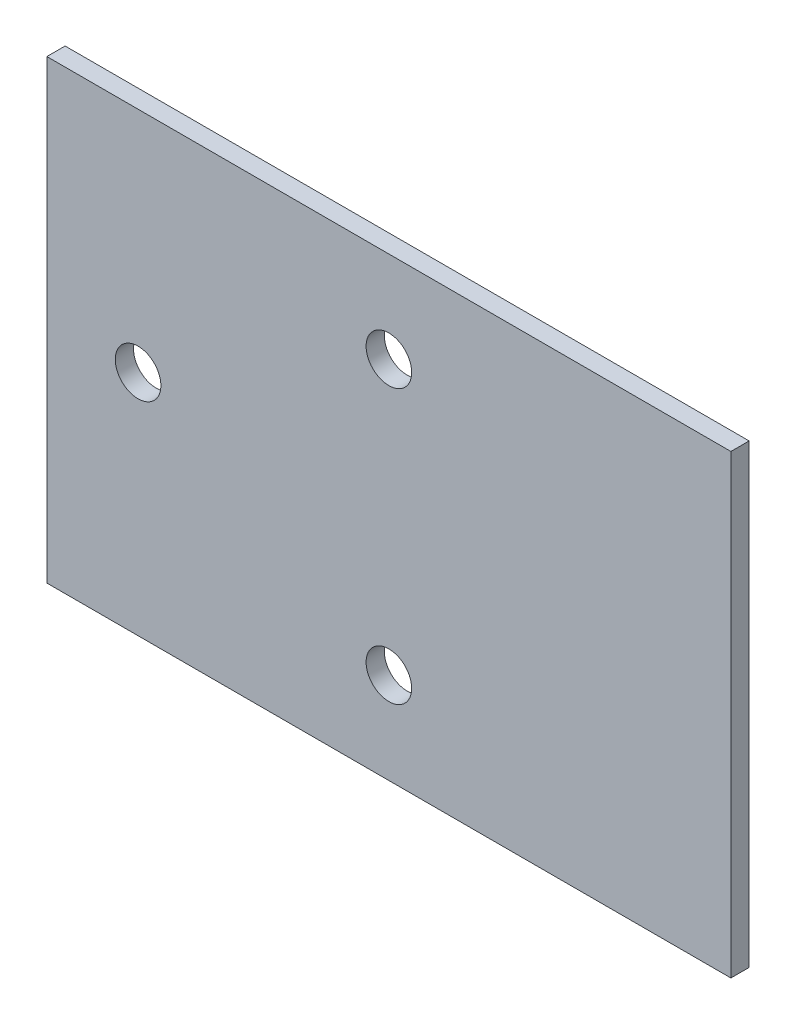
ISO-10303-21;
HEADER;
FILE_DESCRIPTION(('STEP AP214'),'2;1');
FILE_NAME('part.step','',(''),(''),'','','');
FILE_SCHEMA(('AUTOMOTIVE_DESIGN { 1 0 10303 214 1 1 1 1 }'));
ENDSEC;
DATA;
#1=APPLICATION_CONTEXT('core data for automotive mechanical design processes');
#2=APPLICATION_PROTOCOL_DEFINITION('international standard','automotive_design',2000,#1);
#3=PRODUCT_CONTEXT('',#1,'mechanical');
#4=PRODUCT('Part','Part','',(#3));
#5=PRODUCT_RELATED_PRODUCT_CATEGORY('part','',(#4));
#6=PRODUCT_DEFINITION_FORMATION('','',#4);
#7=PRODUCT_DEFINITION_CONTEXT('part definition',#1,'design');
#8=PRODUCT_DEFINITION('design','',#6,#7);
#9=PRODUCT_DEFINITION_SHAPE('','',#8);
#10=(LENGTH_UNIT() NAMED_UNIT(*) SI_UNIT(.MILLI.,.METRE.));
#11=(NAMED_UNIT(*) PLANE_ANGLE_UNIT() SI_UNIT($,.RADIAN.));
#12=(NAMED_UNIT(*) SI_UNIT($,.STERADIAN.) SOLID_ANGLE_UNIT());
#13=UNCERTAINTY_MEASURE_WITH_UNIT(LENGTH_MEASURE(1.E-05),#10,'distance_accuracy_value','');
#14=(GEOMETRIC_REPRESENTATION_CONTEXT(3) GLOBAL_UNCERTAINTY_ASSIGNED_CONTEXT((#13)) GLOBAL_UNIT_ASSIGNED_CONTEXT((#10,
#11,#12)) REPRESENTATION_CONTEXT('',''));
#15=CARTESIAN_POINT('',(0.,0.,0.));
#16=DIRECTION('',(0.,0.,1.));
#17=DIRECTION('',(1.,0.,0.));
#18=AXIS2_PLACEMENT_3D('',#15,#16,#17);
#19=CARTESIAN_POINT('',(0.,0.,-2.));
#20=DIRECTION('',(-1.,0.,0.));
#21=DIRECTION('',(0.,0.,1.));
#22=AXIS2_PLACEMENT_3D('',#19,#20,#21);
#23=PLANE('',#22);
#24=DIRECTION('',(0.,-1.,0.));
#25=VECTOR('',#24,1.);
#26=CARTESIAN_POINT('',(0.,0.,0.));
#27=LINE('',#26,#25);
#28=CARTESIAN_POINT('',(0.,50.,0.));
#29=VERTEX_POINT('',#28);
#30=CARTESIAN_POINT('',(0.,0.,0.));
#31=VERTEX_POINT('',#30);
#32=EDGE_CURVE('E102',#29,#31,#27,.T.);
#33=ORIENTED_EDGE('',*,*,#32,.F.);
#34=DIRECTION('',(0.,0.,1.));
#35=VECTOR('',#34,1.);
#36=CARTESIAN_POINT('',(0.,50.,-2.));
#37=LINE('',#36,#35);
#38=CARTESIAN_POINT('',(0.,50.,-2.));
#39=VERTEX_POINT('',#38);
#40=EDGE_CURVE('E11',#39,#29,#37,.T.);
#41=ORIENTED_EDGE('',*,*,#40,.F.);
#42=DIRECTION('',(0.,-1.,0.));
#43=VECTOR('',#42,1.);
#44=CARTESIAN_POINT('',(0.,0.,-2.));
#45=LINE('',#44,#43);
#46=CARTESIAN_POINT('',(0.,0.,-2.));
#47=VERTEX_POINT('',#46);
#48=EDGE_CURVE('E95',#39,#47,#45,.T.);
#49=ORIENTED_EDGE('',*,*,#48,.T.);
#50=DIRECTION('',(0.,0.,1.));
#51=VECTOR('',#50,1.);
#52=CARTESIAN_POINT('',(0.,0.,-2.));
#53=LINE('',#52,#51);
#54=EDGE_CURVE('E40',#47,#31,#53,.T.);
#55=ORIENTED_EDGE('',*,*,#54,.T.);
#56=EDGE_LOOP('',(#33,#41,#49,#55));
#57=FACE_BOUND('',#56,.T.);
#58=ADVANCED_FACE('F37',(#57),#23,.T.);
#59=CARTESIAN_POINT('',(0.,50.,-2.));
#60=DIRECTION('',(0.,1.,0.));
#61=DIRECTION('',(0.,0.,1.));
#62=AXIS2_PLACEMENT_3D('',#59,#60,#61);
#63=PLANE('',#62);
#64=DIRECTION('',(-1.,0.,0.));
#65=VECTOR('',#64,1.);
#66=CARTESIAN_POINT('',(0.,50.,0.));
#67=LINE('',#66,#65);
#68=CARTESIAN_POINT('',(75.,50.,0.));
#69=VERTEX_POINT('',#68);
#70=EDGE_CURVE('E97',#69,#29,#67,.T.);
#71=ORIENTED_EDGE('',*,*,#70,.F.);
#72=DIRECTION('',(0.,0.,1.));
#73=VECTOR('',#72,1.);
#74=CARTESIAN_POINT('',(75.,50.,-2.));
#75=LINE('',#74,#73);
#76=CARTESIAN_POINT('',(75.,50.,-2.));
#77=VERTEX_POINT('',#76);
#78=EDGE_CURVE('E46',#77,#69,#75,.T.);
#79=ORIENTED_EDGE('',*,*,#78,.F.);
#80=DIRECTION('',(-1.,0.,0.));
#81=VECTOR('',#80,1.);
#82=CARTESIAN_POINT('',(0.,50.,-2.));
#83=LINE('',#82,#81);
#84=EDGE_CURVE('E92',#77,#39,#83,.T.);
#85=ORIENTED_EDGE('',*,*,#84,.T.);
#86=ORIENTED_EDGE('',*,*,#40,.T.);
#87=EDGE_LOOP('',(#71,#79,#85,#86));
#88=FACE_BOUND('',#87,.T.);
#89=ADVANCED_FACE('F113',(#88),#63,.T.);
#90=CARTESIAN_POINT('',(75.,0.,-2.));
#91=DIRECTION('',(1.,0.,0.));
#92=DIRECTION('',(0.,0.,-1.));
#93=AXIS2_PLACEMENT_3D('',#90,#91,#92);
#94=PLANE('',#93);
#95=DIRECTION('',(0.,1.,0.));
#96=VECTOR('',#95,1.);
#97=CARTESIAN_POINT('',(75.,0.,0.));
#98=LINE('',#97,#96);
#99=CARTESIAN_POINT('',(75.,0.,0.));
#100=VERTEX_POINT('',#99);
#101=EDGE_CURVE('E87',#100,#69,#98,.T.);
#102=ORIENTED_EDGE('',*,*,#101,.F.);
#103=DIRECTION('',(0.,0.,1.));
#104=VECTOR('',#103,1.);
#105=CARTESIAN_POINT('',(75.,0.,-2.));
#106=LINE('',#105,#104);
#107=CARTESIAN_POINT('',(75.,0.,-2.));
#108=VERTEX_POINT('',#107);
#109=EDGE_CURVE('E82',#108,#100,#106,.T.);
#110=ORIENTED_EDGE('',*,*,#109,.F.);
#111=DIRECTION('',(0.,1.,0.));
#112=VECTOR('',#111,1.);
#113=CARTESIAN_POINT('',(75.,0.,-2.));
#114=LINE('',#113,#112);
#115=EDGE_CURVE('E85',#108,#77,#114,.T.);
#116=ORIENTED_EDGE('',*,*,#115,.T.);
#117=ORIENTED_EDGE('',*,*,#78,.T.);
#118=EDGE_LOOP('',(#102,#110,#116,#117));
#119=FACE_BOUND('',#118,.T.);
#120=ADVANCED_FACE('F84',(#119),#94,.T.);
#121=CARTESIAN_POINT('',(0.,0.,-2.));
#122=DIRECTION('',(0.,-1.,0.));
#123=DIRECTION('',(0.,0.,-1.));
#124=AXIS2_PLACEMENT_3D('',#121,#122,#123);
#125=PLANE('',#124);
#126=DIRECTION('',(1.,0.,0.));
#127=VECTOR('',#126,1.);
#128=CARTESIAN_POINT('',(0.,0.,0.));
#129=LINE('',#128,#127);
#130=EDGE_CURVE('E105',#31,#100,#129,.T.);
#131=ORIENTED_EDGE('',*,*,#130,.F.);
#132=ORIENTED_EDGE('',*,*,#54,.F.);
#133=DIRECTION('',(1.,0.,0.));
#134=VECTOR('',#133,1.);
#135=CARTESIAN_POINT('',(0.,0.,-2.));
#136=LINE('',#135,#134);
#137=EDGE_CURVE('E91',#47,#108,#136,.T.);
#138=ORIENTED_EDGE('',*,*,#137,.T.);
#139=ORIENTED_EDGE('',*,*,#109,.T.);
#140=EDGE_LOOP('',(#131,#132,#138,#139));
#141=FACE_BOUND('',#140,.T.);
#142=ADVANCED_FACE('F94',(#141),#125,.T.);
#143=CARTESIAN_POINT('',(0.,0.,-2.));
#144=DIRECTION('',(0.,0.,-1.));
#145=DIRECTION('',(-1.,0.,0.));
#146=AXIS2_PLACEMENT_3D('',#143,#144,#145);
#147=PLANE('',#146);
#148=CARTESIAN_POINT('',(37.5,40.,-2.));
#149=DIRECTION('',(0.,0.,-1.));
#150=DIRECTION('',(-1.,0.,0.));
#151=AXIS2_PLACEMENT_3D('',#148,#149,#150);
#152=CIRCLE('',#151,2.5);
#153=CARTESIAN_POINT('',(35.,40.,-2.));
#154=VERTEX_POINT('',#153);
#155=EDGE_CURVE('E150',#154,#154,#152,.F.);
#156=ORIENTED_EDGE('',*,*,#155,.T.);
#157=EDGE_LOOP('',(#156));
#158=FACE_BOUND('',#157,.T.);
#159=CARTESIAN_POINT('',(37.5,10.,-2.));
#160=DIRECTION('',(0.,0.,-1.));
#161=DIRECTION('',(-1.,0.,0.));
#162=AXIS2_PLACEMENT_3D('',#159,#160,#161);
#163=CIRCLE('',#162,2.49999999999999);
#164=CARTESIAN_POINT('',(35.,10.,-2.));
#165=VERTEX_POINT('',#164);
#166=EDGE_CURVE('E154',#165,#165,#163,.F.);
#167=ORIENTED_EDGE('',*,*,#166,.T.);
#168=EDGE_LOOP('',(#167));
#169=FACE_BOUND('',#168,.T.);
#170=CARTESIAN_POINT('',(10.,25.,-2.));
#171=DIRECTION('',(0.,0.,-1.));
#172=DIRECTION('',(-1.,0.,0.));
#173=AXIS2_PLACEMENT_3D('',#170,#171,#172);
#174=CIRCLE('',#173,2.5);
#175=CARTESIAN_POINT('',(7.5,25.,-2.));
#176=VERTEX_POINT('',#175);
#177=EDGE_CURVE('E162',#176,#176,#174,.F.);
#178=ORIENTED_EDGE('',*,*,#177,.T.);
#179=EDGE_LOOP('',(#178));
#180=FACE_BOUND('',#179,.T.);
#181=ORIENTED_EDGE('',*,*,#48,.F.);
#182=ORIENTED_EDGE('',*,*,#84,.F.);
#183=ORIENTED_EDGE('',*,*,#115,.F.);
#184=ORIENTED_EDGE('',*,*,#137,.F.);
#185=EDGE_LOOP('',(#181,#182,#183,#184));
#186=FACE_BOUND('',#185,.T.);
#187=ADVANCED_FACE('F90',(#158,#169,#180,#186),#147,.T.);
#188=CARTESIAN_POINT('',(0.,0.,0.));
#189=DIRECTION('',(0.,0.,-1.));
#190=DIRECTION('',(-1.,0.,0.));
#191=AXIS2_PLACEMENT_3D('',#188,#189,#190);
#192=PLANE('',#191);
#193=CARTESIAN_POINT('',(37.5,40.,0.));
#194=DIRECTION('',(0.,0.,1.));
#195=DIRECTION('',(1.,0.,0.));
#196=AXIS2_PLACEMENT_3D('',#193,#194,#195);
#197=CIRCLE('',#196,2.5);
#198=CARTESIAN_POINT('',(40.,40.,0.));
#199=VERTEX_POINT('',#198);
#200=EDGE_CURVE('E153',#199,#199,#197,.T.);
#201=ORIENTED_EDGE('',*,*,#200,.F.);
#202=EDGE_LOOP('',(#201));
#203=FACE_BOUND('',#202,.T.);
#204=CARTESIAN_POINT('',(37.5,10.,0.));
#205=DIRECTION('',(0.,0.,1.));
#206=DIRECTION('',(1.,0.,0.));
#207=AXIS2_PLACEMENT_3D('',#204,#205,#206);
#208=CIRCLE('',#207,2.49999999999999);
#209=CARTESIAN_POINT('',(40.,10.,0.));
#210=VERTEX_POINT('',#209);
#211=EDGE_CURVE('E157',#210,#210,#208,.T.);
#212=ORIENTED_EDGE('',*,*,#211,.F.);
#213=EDGE_LOOP('',(#212));
#214=FACE_BOUND('',#213,.T.);
#215=CARTESIAN_POINT('',(10.,25.,0.));
#216=DIRECTION('',(0.,0.,1.));
#217=DIRECTION('',(1.,0.,0.));
#218=AXIS2_PLACEMENT_3D('',#215,#216,#217);
#219=CIRCLE('',#218,2.5);
#220=CARTESIAN_POINT('',(12.5,25.,0.));
#221=VERTEX_POINT('',#220);
#222=EDGE_CURVE('E106',#221,#221,#219,.T.);
#223=ORIENTED_EDGE('',*,*,#222,.F.);
#224=EDGE_LOOP('',(#223));
#225=FACE_BOUND('',#224,.T.);
#226=ORIENTED_EDGE('',*,*,#32,.T.);
#227=ORIENTED_EDGE('',*,*,#130,.T.);
#228=ORIENTED_EDGE('',*,*,#101,.T.);
#229=ORIENTED_EDGE('',*,*,#70,.T.);
#230=EDGE_LOOP('',(#226,#227,#228,#229));
#231=FACE_BOUND('',#230,.T.);
#232=ADVANCED_FACE('F112',(#203,#214,#225,#231),#192,.F.);
#233=CARTESIAN_POINT('',(10.,25.,-2.001));
#234=DIRECTION('',(0.,0.,1.));
#235=DIRECTION('',(1.,0.,0.));
#236=AXIS2_PLACEMENT_3D('',#233,#234,#235);
#237=CYLINDRICAL_SURFACE('',#236,2.5);
#238=ORIENTED_EDGE('',*,*,#177,.F.);
#239=EDGE_LOOP('',(#238));
#240=FACE_BOUND('',#239,.T.);
#241=ORIENTED_EDGE('',*,*,#222,.T.);
#242=EDGE_LOOP('',(#241));
#243=FACE_BOUND('',#242,.T.);
#244=ADVANCED_FACE('F131',(#240,#243),#237,.F.);
#245=CARTESIAN_POINT('',(37.5,10.,-2.001));
#246=DIRECTION('',(0.,0.,1.));
#247=DIRECTION('',(1.,0.,0.));
#248=AXIS2_PLACEMENT_3D('',#245,#246,#247);
#249=CYLINDRICAL_SURFACE('',#248,2.49999999999999);
#250=ORIENTED_EDGE('',*,*,#166,.F.);
#251=EDGE_LOOP('',(#250));
#252=FACE_BOUND('',#251,.T.);
#253=ORIENTED_EDGE('',*,*,#211,.T.);
#254=EDGE_LOOP('',(#253));
#255=FACE_BOUND('',#254,.T.);
#256=ADVANCED_FACE('F138',(#252,#255),#249,.F.);
#257=CARTESIAN_POINT('',(37.5,40.,-2.001));
#258=DIRECTION('',(0.,0.,1.));
#259=DIRECTION('',(1.,0.,0.));
#260=AXIS2_PLACEMENT_3D('',#257,#258,#259);
#261=CYLINDRICAL_SURFACE('',#260,2.5);
#262=ORIENTED_EDGE('',*,*,#155,.F.);
#263=EDGE_LOOP('',(#262));
#264=FACE_BOUND('',#263,.T.);
#265=ORIENTED_EDGE('',*,*,#200,.T.);
#266=EDGE_LOOP('',(#265));
#267=FACE_BOUND('',#266,.T.);
#268=ADVANCED_FACE('F142',(#264,#267),#261,.F.);
#269=CLOSED_SHELL('',(#58,#89,#120,#142,#187,#232,#244,#256,#268));
#270=MANIFOLD_SOLID_BREP('B2',#269);
#271=ADVANCED_BREP_SHAPE_REPRESENTATION('',(#18,#270),#14);
#272=SHAPE_DEFINITION_REPRESENTATION(#9,#271);
ENDSEC;
END-ISO-10303-21;
